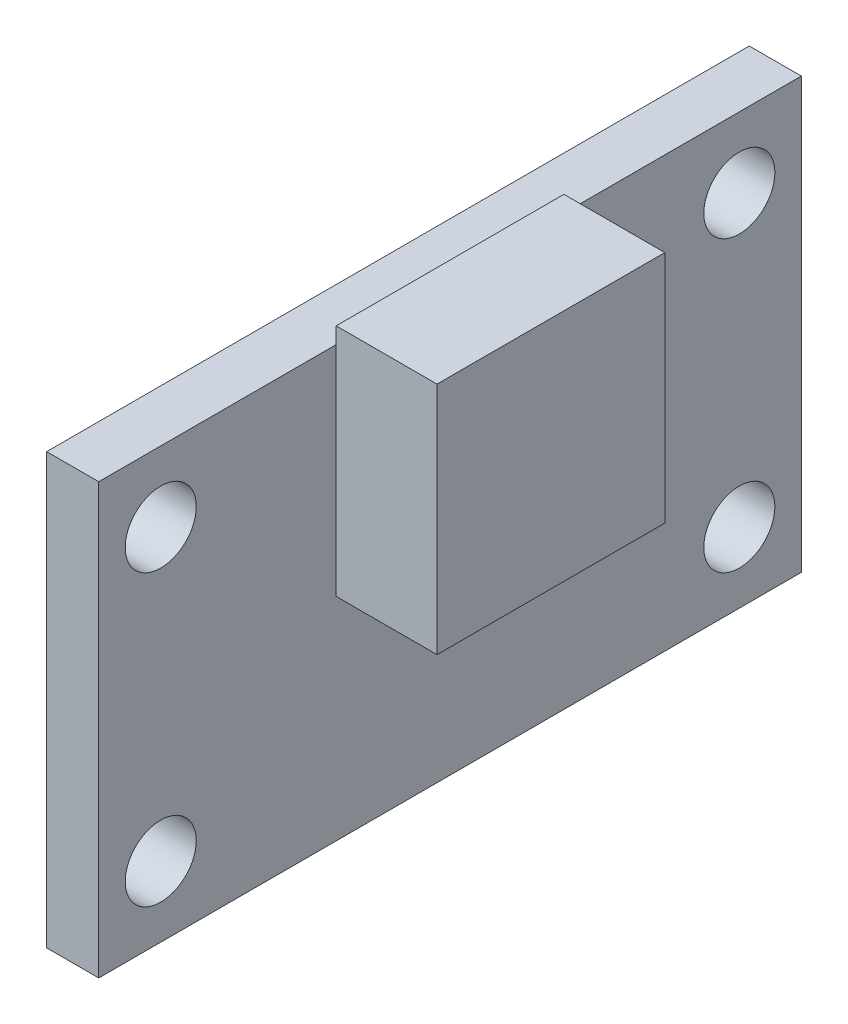
ISO-10303-21;
HEADER;
FILE_DESCRIPTION(('STEP AP214'),'2;1');
FILE_NAME('part.step','',(''),(''),'','','');
FILE_SCHEMA(('AUTOMOTIVE_DESIGN { 1 0 10303 214 1 1 1 1 }'));
ENDSEC;
DATA;
#1=APPLICATION_CONTEXT('core data for automotive mechanical design processes');
#2=APPLICATION_PROTOCOL_DEFINITION('international standard','automotive_design',2000,#1);
#3=PRODUCT_CONTEXT('',#1,'mechanical');
#4=PRODUCT('Part','Part','',(#3));
#5=PRODUCT_RELATED_PRODUCT_CATEGORY('part','',(#4));
#6=PRODUCT_DEFINITION_FORMATION('','',#4);
#7=PRODUCT_DEFINITION_CONTEXT('part definition',#1,'design');
#8=PRODUCT_DEFINITION('design','',#6,#7);
#9=PRODUCT_DEFINITION_SHAPE('','',#8);
#10=(LENGTH_UNIT() NAMED_UNIT(*) SI_UNIT(.MILLI.,.METRE.));
#11=(NAMED_UNIT(*) PLANE_ANGLE_UNIT() SI_UNIT($,.RADIAN.));
#12=(NAMED_UNIT(*) SI_UNIT($,.STERADIAN.) SOLID_ANGLE_UNIT());
#13=UNCERTAINTY_MEASURE_WITH_UNIT(LENGTH_MEASURE(1.E-05),#10,'distance_accuracy_value','');
#14=(GEOMETRIC_REPRESENTATION_CONTEXT(3) GLOBAL_UNCERTAINTY_ASSIGNED_CONTEXT((#13)) GLOBAL_UNIT_ASSIGNED_CONTEXT((#10,
#11,#12)) REPRESENTATION_CONTEXT('',''));
#15=CARTESIAN_POINT('',(0.,0.,0.));
#16=DIRECTION('',(0.,0.,1.));
#17=DIRECTION('',(1.,0.,0.));
#18=AXIS2_PLACEMENT_3D('',#15,#16,#17);
#19=CARTESIAN_POINT('',(1.6,0.,0.));
#20=DIRECTION('',(-1.,0.,0.));
#21=DIRECTION('',(0.,0.,1.));
#22=AXIS2_PLACEMENT_3D('',#19,#20,#21);
#23=PLANE('',#22);
#24=CARTESIAN_POINT('',(1.6,2.159,-1.905));
#25=DIRECTION('',(1.,0.,0.));
#26=DIRECTION('',(0.,0.,-1.));
#27=AXIS2_PLACEMENT_3D('',#24,#25,#26);
#28=CIRCLE('',#27,1.0922);
#29=CARTESIAN_POINT('',(1.6,2.159,-2.9972));
#30=VERTEX_POINT('',#29);
#31=EDGE_CURVE('E149',#30,#30,#28,.T.);
#32=ORIENTED_EDGE('',*,*,#31,.F.);
#33=EDGE_LOOP('',(#32));
#34=FACE_BOUND('',#33,.T.);
#35=CARTESIAN_POINT('',(1.6,2.159,-19.685));
#36=DIRECTION('',(1.,0.,0.));
#37=DIRECTION('',(0.,0.,-1.));
#38=AXIS2_PLACEMENT_3D('',#35,#36,#37);
#39=CIRCLE('',#38,1.0922);
#40=CARTESIAN_POINT('',(1.6,2.159,-20.7772));
#41=VERTEX_POINT('',#40);
#42=EDGE_CURVE('E143',#41,#41,#39,.T.);
#43=ORIENTED_EDGE('',*,*,#42,.F.);
#44=EDGE_LOOP('',(#43));
#45=FACE_BOUND('',#44,.T.);
#46=CARTESIAN_POINT('',(1.6,11.049,-19.685));
#47=DIRECTION('',(1.,0.,0.));
#48=DIRECTION('',(0.,0.,-1.));
#49=AXIS2_PLACEMENT_3D('',#46,#47,#48);
#50=CIRCLE('',#49,1.0922);
#51=CARTESIAN_POINT('',(1.6,11.049,-20.7772));
#52=VERTEX_POINT('',#51);
#53=EDGE_CURVE('E137',#52,#52,#50,.T.);
#54=ORIENTED_EDGE('',*,*,#53,.F.);
#55=EDGE_LOOP('',(#54));
#56=FACE_BOUND('',#55,.T.);
#57=CARTESIAN_POINT('',(1.6,11.049,-1.905));
#58=DIRECTION('',(1.,0.,0.));
#59=DIRECTION('',(0.,0.,-1.));
#60=AXIS2_PLACEMENT_3D('',#57,#58,#59);
#61=CIRCLE('',#60,1.0922);
#62=CARTESIAN_POINT('',(1.6,11.049,-2.9972));
#63=VERTEX_POINT('',#62);
#64=EDGE_CURVE('E126',#63,#63,#61,.T.);
#65=ORIENTED_EDGE('',*,*,#64,.F.);
#66=EDGE_LOOP('',(#65));
#67=FACE_BOUND('',#66,.T.);
#68=DIRECTION('',(0.,-1.,0.));
#69=VECTOR('',#68,1.);
#70=CARTESIAN_POINT('',(1.6,6.508,-7.295));
#71=LINE('',#70,#69);
#72=CARTESIAN_POINT('',(1.6,13.208,-7.295));
#73=VERTEX_POINT('',#72);
#74=CARTESIAN_POINT('',(1.6,6.508,-7.295));
#75=VERTEX_POINT('',#74);
#76=EDGE_CURVE('E11',#73,#75,#71,.T.);
#77=ORIENTED_EDGE('',*,*,#76,.F.);
#78=DIRECTION('',(0.,0.,1.));
#79=VECTOR('',#78,1.);
#80=CARTESIAN_POINT('',(1.6,13.208,0.));
#81=LINE('',#80,#79);
#82=CARTESIAN_POINT('',(1.6,13.208,0.));
#83=VERTEX_POINT('',#82);
#84=EDGE_CURVE('E164',#73,#83,#81,.T.);
#85=ORIENTED_EDGE('',*,*,#84,.T.);
#86=DIRECTION('',(0.,-1.,0.));
#87=VECTOR('',#86,1.);
#88=CARTESIAN_POINT('',(1.6,0.,0.));
#89=LINE('',#88,#87);
#90=CARTESIAN_POINT('',(1.6,0.,0.));
#91=VERTEX_POINT('',#90);
#92=EDGE_CURVE('E156',#83,#91,#89,.T.);
#93=ORIENTED_EDGE('',*,*,#92,.T.);
#94=DIRECTION('',(0.,0.,-1.));
#95=VECTOR('',#94,1.);
#96=CARTESIAN_POINT('',(1.6,0.,0.));
#97=LINE('',#96,#95);
#98=CARTESIAN_POINT('',(1.6,0.,-21.59));
#99=VERTEX_POINT('',#98);
#100=EDGE_CURVE('E159',#91,#99,#97,.T.);
#101=ORIENTED_EDGE('',*,*,#100,.T.);
#102=DIRECTION('',(0.,1.,0.));
#103=VECTOR('',#102,1.);
#104=CARTESIAN_POINT('',(1.6,0.,-21.59));
#105=LINE('',#104,#103);
#106=CARTESIAN_POINT('',(1.6,13.208,-21.59));
#107=VERTEX_POINT('',#106);
#108=EDGE_CURVE('E162',#99,#107,#105,.T.);
#109=ORIENTED_EDGE('',*,*,#108,.T.);
#110=CARTESIAN_POINT('',(1.6,13.208,-14.295));
#111=VERTEX_POINT('',#110);
#112=EDGE_CURVE('E165',#107,#111,#81,.T.);
#113=ORIENTED_EDGE('',*,*,#112,.T.);
#114=DIRECTION('',(0.,1.,0.));
#115=VECTOR('',#114,1.);
#116=CARTESIAN_POINT('',(1.6,6.508,-14.295));
#117=LINE('',#116,#115);
#118=CARTESIAN_POINT('',(1.6,6.508,-14.295));
#119=VERTEX_POINT('',#118);
#120=EDGE_CURVE('E206',#119,#111,#117,.T.);
#121=ORIENTED_EDGE('',*,*,#120,.F.);
#122=DIRECTION('',(0.,0.,-1.));
#123=VECTOR('',#122,1.);
#124=CARTESIAN_POINT('',(1.6,6.508,-7.295));
#125=LINE('',#124,#123);
#126=EDGE_CURVE('E51',#75,#119,#125,.T.);
#127=ORIENTED_EDGE('',*,*,#126,.F.);
#128=EDGE_LOOP('',(#77,#85,#93,#101,#109,#113,#121,#127));
#129=FACE_BOUND('',#128,.T.);
#130=ADVANCED_FACE('F34',(#34,#45,#56,#67,#129),#23,.F.);
#131=CARTESIAN_POINT('',(1.6,0.,0.));
#132=DIRECTION('',(0.,0.,-1.));
#133=DIRECTION('',(-1.,0.,0.));
#134=AXIS2_PLACEMENT_3D('',#131,#132,#133);
#135=PLANE('',#134);
#136=DIRECTION('',(0.,-1.,0.));
#137=VECTOR('',#136,1.);
#138=CARTESIAN_POINT('',(0.,0.,0.));
#139=LINE('',#138,#137);
#140=CARTESIAN_POINT('',(0.,13.208,0.));
#141=VERTEX_POINT('',#140);
#142=CARTESIAN_POINT('',(0.,0.,0.));
#143=VERTEX_POINT('',#142);
#144=EDGE_CURVE('E155',#141,#143,#139,.T.);
#145=ORIENTED_EDGE('',*,*,#144,.T.);
#146=DIRECTION('',(-1.,0.,0.));
#147=VECTOR('',#146,1.);
#148=CARTESIAN_POINT('',(1.6,0.,0.));
#149=LINE('',#148,#147);
#150=EDGE_CURVE('E38',#91,#143,#149,.T.);
#151=ORIENTED_EDGE('',*,*,#150,.F.);
#152=ORIENTED_EDGE('',*,*,#92,.F.);
#153=DIRECTION('',(-1.,0.,0.));
#154=VECTOR('',#153,1.);
#155=CARTESIAN_POINT('',(1.6,13.208,0.));
#156=LINE('',#155,#154);
#157=EDGE_CURVE('E168',#83,#141,#156,.T.);
#158=ORIENTED_EDGE('',*,*,#157,.T.);
#159=EDGE_LOOP('',(#145,#151,#152,#158));
#160=FACE_BOUND('',#159,.T.);
#161=ADVANCED_FACE('F36',(#160),#135,.F.);
#162=CARTESIAN_POINT('',(1.6,0.,0.));
#163=DIRECTION('',(0.,1.,0.));
#164=DIRECTION('',(0.,0.,1.));
#165=AXIS2_PLACEMENT_3D('',#162,#163,#164);
#166=PLANE('',#165);
#167=DIRECTION('',(0.,0.,-1.));
#168=VECTOR('',#167,1.);
#169=CARTESIAN_POINT('',(0.,0.,0.));
#170=LINE('',#169,#168);
#171=CARTESIAN_POINT('',(0.,0.,-21.59));
#172=VERTEX_POINT('',#171);
#173=EDGE_CURVE('E172',#143,#172,#170,.T.);
#174=ORIENTED_EDGE('',*,*,#173,.T.);
#175=DIRECTION('',(-1.,0.,0.));
#176=VECTOR('',#175,1.);
#177=CARTESIAN_POINT('',(1.6,0.,-21.59));
#178=LINE('',#177,#176);
#179=EDGE_CURVE('E181',#99,#172,#178,.T.);
#180=ORIENTED_EDGE('',*,*,#179,.F.);
#181=ORIENTED_EDGE('',*,*,#100,.F.);
#182=ORIENTED_EDGE('',*,*,#150,.T.);
#183=EDGE_LOOP('',(#174,#180,#181,#182));
#184=FACE_BOUND('',#183,.T.);
#185=ADVANCED_FACE('F190',(#184),#166,.F.);
#186=CARTESIAN_POINT('',(1.6,0.,-21.59));
#187=DIRECTION('',(0.,0.,1.));
#188=DIRECTION('',(1.,0.,0.));
#189=AXIS2_PLACEMENT_3D('',#186,#187,#188);
#190=PLANE('',#189);
#191=DIRECTION('',(0.,1.,0.));
#192=VECTOR('',#191,1.);
#193=CARTESIAN_POINT('',(0.,0.,-21.59));
#194=LINE('',#193,#192);
#195=CARTESIAN_POINT('',(0.,13.208,-21.59));
#196=VERTEX_POINT('',#195);
#197=EDGE_CURVE('E174',#172,#196,#194,.T.);
#198=ORIENTED_EDGE('',*,*,#197,.T.);
#199=DIRECTION('',(-1.,0.,0.));
#200=VECTOR('',#199,1.);
#201=CARTESIAN_POINT('',(1.6,13.208,-21.59));
#202=LINE('',#201,#200);
#203=EDGE_CURVE('E179',#107,#196,#202,.T.);
#204=ORIENTED_EDGE('',*,*,#203,.F.);
#205=ORIENTED_EDGE('',*,*,#108,.F.);
#206=ORIENTED_EDGE('',*,*,#179,.T.);
#207=EDGE_LOOP('',(#198,#204,#205,#206));
#208=FACE_BOUND('',#207,.T.);
#209=ADVANCED_FACE('F199',(#208),#190,.F.);
#210=CARTESIAN_POINT('',(1.6,13.208,0.));
#211=DIRECTION('',(0.,-1.,0.));
#212=DIRECTION('',(0.,0.,-1.));
#213=AXIS2_PLACEMENT_3D('',#210,#211,#212);
#214=PLANE('',#213);
#215=DIRECTION('',(0.,0.,1.));
#216=VECTOR('',#215,1.);
#217=CARTESIAN_POINT('',(0.,13.208,0.));
#218=LINE('',#217,#216);
#219=EDGE_CURVE('E160',#196,#141,#218,.T.);
#220=ORIENTED_EDGE('',*,*,#219,.T.);
#221=ORIENTED_EDGE('',*,*,#157,.F.);
#222=ORIENTED_EDGE('',*,*,#84,.F.);
#223=EDGE_CURVE('E169',#111,#73,#81,.T.);
#224=ORIENTED_EDGE('',*,*,#223,.F.);
#225=ORIENTED_EDGE('',*,*,#112,.F.);
#226=ORIENTED_EDGE('',*,*,#203,.T.);
#227=EDGE_LOOP('',(#220,#221,#222,#224,#225,#226));
#228=FACE_BOUND('',#227,.T.);
#229=ADVANCED_FACE('F202',(#228),#214,.F.);
#230=CARTESIAN_POINT('',(0.,0.,0.));
#231=DIRECTION('',(-1.,0.,0.));
#232=DIRECTION('',(0.,0.,1.));
#233=AXIS2_PLACEMENT_3D('',#230,#231,#232);
#234=PLANE('',#233);
#235=CARTESIAN_POINT('',(0.,11.049,-1.905));
#236=DIRECTION('',(1.,0.,0.));
#237=DIRECTION('',(0.,0.,-1.));
#238=AXIS2_PLACEMENT_3D('',#235,#236,#237);
#239=CIRCLE('',#238,1.0922);
#240=CARTESIAN_POINT('',(0.,11.049,-2.9972));
#241=VERTEX_POINT('',#240);
#242=EDGE_CURVE('E129',#241,#241,#239,.T.);
#243=ORIENTED_EDGE('',*,*,#242,.T.);
#244=EDGE_LOOP('',(#243));
#245=FACE_BOUND('',#244,.T.);
#246=CARTESIAN_POINT('',(0.,11.049,-19.685));
#247=DIRECTION('',(1.,0.,0.));
#248=DIRECTION('',(0.,0.,-1.));
#249=AXIS2_PLACEMENT_3D('',#246,#247,#248);
#250=CIRCLE('',#249,1.0922);
#251=CARTESIAN_POINT('',(0.,11.049,-20.7772));
#252=VERTEX_POINT('',#251);
#253=EDGE_CURVE('E140',#252,#252,#250,.T.);
#254=ORIENTED_EDGE('',*,*,#253,.T.);
#255=EDGE_LOOP('',(#254));
#256=FACE_BOUND('',#255,.T.);
#257=CARTESIAN_POINT('',(0.,2.159,-19.685));
#258=DIRECTION('',(1.,0.,0.));
#259=DIRECTION('',(0.,0.,-1.));
#260=AXIS2_PLACEMENT_3D('',#257,#258,#259);
#261=CIRCLE('',#260,1.0922);
#262=CARTESIAN_POINT('',(0.,2.159,-20.7772));
#263=VERTEX_POINT('',#262);
#264=EDGE_CURVE('E146',#263,#263,#261,.T.);
#265=ORIENTED_EDGE('',*,*,#264,.T.);
#266=EDGE_LOOP('',(#265));
#267=FACE_BOUND('',#266,.T.);
#268=CARTESIAN_POINT('',(0.,2.159,-1.905));
#269=DIRECTION('',(1.,0.,0.));
#270=DIRECTION('',(0.,0.,-1.));
#271=AXIS2_PLACEMENT_3D('',#268,#269,#270);
#272=CIRCLE('',#271,1.0922);
#273=CARTESIAN_POINT('',(0.,2.159,-2.9972));
#274=VERTEX_POINT('',#273);
#275=EDGE_CURVE('E152',#274,#274,#272,.T.);
#276=ORIENTED_EDGE('',*,*,#275,.T.);
#277=EDGE_LOOP('',(#276));
#278=FACE_BOUND('',#277,.T.);
#279=ORIENTED_EDGE('',*,*,#144,.F.);
#280=ORIENTED_EDGE('',*,*,#219,.F.);
#281=ORIENTED_EDGE('',*,*,#197,.F.);
#282=ORIENTED_EDGE('',*,*,#173,.F.);
#283=EDGE_LOOP('',(#279,#280,#281,#282));
#284=FACE_BOUND('',#283,.T.);
#285=ADVANCED_FACE('F197',(#245,#256,#267,#278,#284),#234,.T.);
#286=CARTESIAN_POINT('',(1.6,2.159,-1.905));
#287=DIRECTION('',(1.,0.,0.));
#288=DIRECTION('',(0.,0.,-1.));
#289=AXIS2_PLACEMENT_3D('',#286,#287,#288);
#290=CYLINDRICAL_SURFACE('',#289,1.0922);
#291=ORIENTED_EDGE('',*,*,#275,.F.);
#292=EDGE_LOOP('',(#291));
#293=FACE_BOUND('',#292,.T.);
#294=ORIENTED_EDGE('',*,*,#31,.T.);
#295=EDGE_LOOP('',(#294));
#296=FACE_BOUND('',#295,.T.);
#297=ADVANCED_FACE('F244',(#293,#296),#290,.F.);
#298=CARTESIAN_POINT('',(1.6,2.159,-19.685));
#299=DIRECTION('',(1.,0.,0.));
#300=DIRECTION('',(0.,0.,-1.));
#301=AXIS2_PLACEMENT_3D('',#298,#299,#300);
#302=CYLINDRICAL_SURFACE('',#301,1.0922);
#303=ORIENTED_EDGE('',*,*,#264,.F.);
#304=EDGE_LOOP('',(#303));
#305=FACE_BOUND('',#304,.T.);
#306=ORIENTED_EDGE('',*,*,#42,.T.);
#307=EDGE_LOOP('',(#306));
#308=FACE_BOUND('',#307,.T.);
#309=ADVANCED_FACE('F276',(#305,#308),#302,.F.);
#310=CARTESIAN_POINT('',(1.6,11.049,-19.685));
#311=DIRECTION('',(1.,0.,0.));
#312=DIRECTION('',(0.,0.,-1.));
#313=AXIS2_PLACEMENT_3D('',#310,#311,#312);
#314=CYLINDRICAL_SURFACE('',#313,1.0922);
#315=ORIENTED_EDGE('',*,*,#253,.F.);
#316=EDGE_LOOP('',(#315));
#317=FACE_BOUND('',#316,.T.);
#318=ORIENTED_EDGE('',*,*,#53,.T.);
#319=EDGE_LOOP('',(#318));
#320=FACE_BOUND('',#319,.T.);
#321=ADVANCED_FACE('F283',(#317,#320),#314,.F.);
#322=CARTESIAN_POINT('',(1.6,11.049,-1.905));
#323=DIRECTION('',(1.,0.,0.));
#324=DIRECTION('',(0.,0.,-1.));
#325=AXIS2_PLACEMENT_3D('',#322,#323,#324);
#326=CYLINDRICAL_SURFACE('',#325,1.0922);
#327=ORIENTED_EDGE('',*,*,#242,.F.);
#328=EDGE_LOOP('',(#327));
#329=FACE_BOUND('',#328,.T.);
#330=ORIENTED_EDGE('',*,*,#64,.T.);
#331=EDGE_LOOP('',(#330));
#332=FACE_BOUND('',#331,.T.);
#333=ADVANCED_FACE('F290',(#329,#332),#326,.F.);
#334=CARTESIAN_POINT('',(4.7,6.508,-7.295));
#335=DIRECTION('',(0.,0.,-1.));
#336=DIRECTION('',(-1.,0.,0.));
#337=AXIS2_PLACEMENT_3D('',#334,#335,#336);
#338=PLANE('',#337);
#339=CARTESIAN_POINT('',(1.6,13.708,-7.295));
#340=VERTEX_POINT('',#339);
#341=EDGE_CURVE('E44',#340,#73,#71,.T.);
#342=ORIENTED_EDGE('',*,*,#341,.T.);
#343=ORIENTED_EDGE('',*,*,#76,.T.);
#344=DIRECTION('',(-1.,0.,0.));
#345=VECTOR('',#344,1.);
#346=CARTESIAN_POINT('',(4.7,6.508,-7.295));
#347=LINE('',#346,#345);
#348=CARTESIAN_POINT('',(4.7,6.508,-7.295));
#349=VERTEX_POINT('',#348);
#350=EDGE_CURVE('E107',#349,#75,#347,.T.);
#351=ORIENTED_EDGE('',*,*,#350,.F.);
#352=DIRECTION('',(0.,-1.,0.));
#353=VECTOR('',#352,1.);
#354=CARTESIAN_POINT('',(4.7,6.508,-7.295));
#355=LINE('',#354,#353);
#356=CARTESIAN_POINT('',(4.7,13.708,-7.295));
#357=VERTEX_POINT('',#356);
#358=EDGE_CURVE('E113',#357,#349,#355,.T.);
#359=ORIENTED_EDGE('',*,*,#358,.F.);
#360=DIRECTION('',(-1.,0.,0.));
#361=VECTOR('',#360,1.);
#362=CARTESIAN_POINT('',(4.7,13.708,-7.295));
#363=LINE('',#362,#361);
#364=EDGE_CURVE('E220',#357,#340,#363,.T.);
#365=ORIENTED_EDGE('',*,*,#364,.T.);
#366=EDGE_LOOP('',(#342,#343,#351,#359,#365));
#367=FACE_BOUND('',#366,.T.);
#368=ADVANCED_FACE('F125',(#367),#338,.F.);
#369=CARTESIAN_POINT('',(4.7,6.508,-7.295));
#370=DIRECTION('',(0.,1.,0.));
#371=DIRECTION('',(0.,0.,1.));
#372=AXIS2_PLACEMENT_3D('',#369,#370,#371);
#373=PLANE('',#372);
#374=ORIENTED_EDGE('',*,*,#126,.T.);
#375=DIRECTION('',(-1.,0.,0.));
#376=VECTOR('',#375,1.);
#377=CARTESIAN_POINT('',(4.7,6.508,-14.295));
#378=LINE('',#377,#376);
#379=CARTESIAN_POINT('',(4.7,6.508,-14.295));
#380=VERTEX_POINT('',#379);
#381=EDGE_CURVE('E109',#380,#119,#378,.T.);
#382=ORIENTED_EDGE('',*,*,#381,.F.);
#383=DIRECTION('',(0.,0.,-1.));
#384=VECTOR('',#383,1.);
#385=CARTESIAN_POINT('',(4.7,6.508,-7.295));
#386=LINE('',#385,#384);
#387=EDGE_CURVE('E103',#349,#380,#386,.T.);
#388=ORIENTED_EDGE('',*,*,#387,.F.);
#389=ORIENTED_EDGE('',*,*,#350,.T.);
#390=EDGE_LOOP('',(#374,#382,#388,#389));
#391=FACE_BOUND('',#390,.T.);
#392=ADVANCED_FACE('F105',(#391),#373,.F.);
#393=CARTESIAN_POINT('',(4.7,6.508,-14.295));
#394=DIRECTION('',(0.,0.,1.));
#395=DIRECTION('',(1.,0.,0.));
#396=AXIS2_PLACEMENT_3D('',#393,#394,#395);
#397=PLANE('',#396);
#398=ORIENTED_EDGE('',*,*,#120,.T.);
#399=CARTESIAN_POINT('',(1.6,13.708,-14.295));
#400=VERTEX_POINT('',#399);
#401=EDGE_CURVE('E209',#111,#400,#117,.T.);
#402=ORIENTED_EDGE('',*,*,#401,.T.);
#403=DIRECTION('',(-1.,0.,0.));
#404=VECTOR('',#403,1.);
#405=CARTESIAN_POINT('',(4.7,13.708,-14.295));
#406=LINE('',#405,#404);
#407=CARTESIAN_POINT('',(4.7,13.708,-14.295));
#408=VERTEX_POINT('',#407);
#409=EDGE_CURVE('E131',#408,#400,#406,.T.);
#410=ORIENTED_EDGE('',*,*,#409,.F.);
#411=DIRECTION('',(0.,1.,0.));
#412=VECTOR('',#411,1.);
#413=CARTESIAN_POINT('',(4.7,6.508,-14.295));
#414=LINE('',#413,#412);
#415=EDGE_CURVE('E112',#380,#408,#414,.T.);
#416=ORIENTED_EDGE('',*,*,#415,.F.);
#417=ORIENTED_EDGE('',*,*,#381,.T.);
#418=EDGE_LOOP('',(#398,#402,#410,#416,#417));
#419=FACE_BOUND('',#418,.T.);
#420=ADVANCED_FACE('F216',(#419),#397,.F.);
#421=CARTESIAN_POINT('',(4.7,13.708,-7.295));
#422=DIRECTION('',(0.,-1.,0.));
#423=DIRECTION('',(0.,0.,-1.));
#424=AXIS2_PLACEMENT_3D('',#421,#422,#423);
#425=PLANE('',#424);
#426=DIRECTION('',(0.,0.,1.));
#427=VECTOR('',#426,1.);
#428=CARTESIAN_POINT('',(1.6,13.708,-7.295));
#429=LINE('',#428,#427);
#430=EDGE_CURVE('E122',#400,#340,#429,.T.);
#431=ORIENTED_EDGE('',*,*,#430,.T.);
#432=ORIENTED_EDGE('',*,*,#364,.F.);
#433=DIRECTION('',(0.,0.,1.));
#434=VECTOR('',#433,1.);
#435=CARTESIAN_POINT('',(4.7,13.708,-7.295));
#436=LINE('',#435,#434);
#437=EDGE_CURVE('E118',#408,#357,#436,.T.);
#438=ORIENTED_EDGE('',*,*,#437,.F.);
#439=ORIENTED_EDGE('',*,*,#409,.T.);
#440=EDGE_LOOP('',(#431,#432,#438,#439));
#441=FACE_BOUND('',#440,.T.);
#442=ADVANCED_FACE('F222',(#441),#425,.F.);
#443=CARTESIAN_POINT('',(4.7,0.,0.));
#444=DIRECTION('',(-1.,0.,0.));
#445=DIRECTION('',(0.,0.,1.));
#446=AXIS2_PLACEMENT_3D('',#443,#444,#445);
#447=PLANE('',#446);
#448=ORIENTED_EDGE('',*,*,#358,.T.);
#449=ORIENTED_EDGE('',*,*,#387,.T.);
#450=ORIENTED_EDGE('',*,*,#415,.T.);
#451=ORIENTED_EDGE('',*,*,#437,.T.);
#452=EDGE_LOOP('',(#448,#449,#450,#451));
#453=FACE_BOUND('',#452,.T.);
#454=ADVANCED_FACE('F116',(#453),#447,.F.);
#455=CARTESIAN_POINT('',(1.6,0.,0.));
#456=DIRECTION('',(-1.,0.,0.));
#457=DIRECTION('',(0.,0.,1.));
#458=AXIS2_PLACEMENT_3D('',#455,#456,#457);
#459=PLANE('',#458);
#460=ORIENTED_EDGE('',*,*,#401,.F.);
#461=ORIENTED_EDGE('',*,*,#223,.T.);
#462=ORIENTED_EDGE('',*,*,#341,.F.);
#463=ORIENTED_EDGE('',*,*,#430,.F.);
#464=EDGE_LOOP('',(#460,#461,#462,#463));
#465=FACE_BOUND('',#464,.T.);
#466=ADVANCED_FACE('F210',(#465),#459,.T.);
#467=CLOSED_SHELL('',(#130,#161,#185,#209,#229,#285,#297,#309,#321,#333,#368,#392,#420,#442,
#454,#466));
#468=MANIFOLD_SOLID_BREP('B2',#467);
#469=ADVANCED_BREP_SHAPE_REPRESENTATION('',(#18,#468),#14);
#470=SHAPE_DEFINITION_REPRESENTATION(#9,#469);
ENDSEC;
END-ISO-10303-21;
